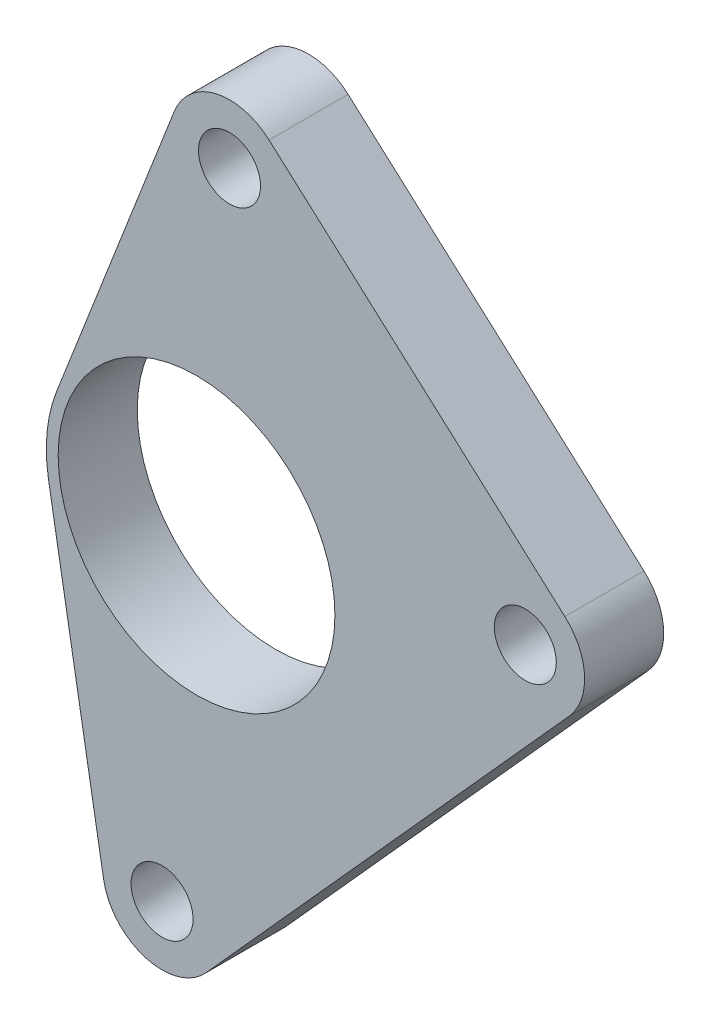
ISO-10303-21;
HEADER;
FILE_DESCRIPTION(('STEP AP214'),'2;1');
FILE_NAME('part.step','',(''),(''),'','','');
FILE_SCHEMA(('AUTOMOTIVE_DESIGN { 1 0 10303 214 1 1 1 1 }'));
ENDSEC;
DATA;
#1=APPLICATION_CONTEXT('core data for automotive mechanical design processes');
#2=APPLICATION_PROTOCOL_DEFINITION('international standard','automotive_design',2000,#1);
#3=PRODUCT_CONTEXT('',#1,'mechanical');
#4=PRODUCT('Part','Part','',(#3));
#5=PRODUCT_RELATED_PRODUCT_CATEGORY('part','',(#4));
#6=PRODUCT_DEFINITION_FORMATION('','',#4);
#7=PRODUCT_DEFINITION_CONTEXT('part definition',#1,'design');
#8=PRODUCT_DEFINITION('design','',#6,#7);
#9=PRODUCT_DEFINITION_SHAPE('','',#8);
#10=(LENGTH_UNIT() NAMED_UNIT(*) SI_UNIT(.MILLI.,.METRE.));
#11=(NAMED_UNIT(*) PLANE_ANGLE_UNIT() SI_UNIT($,.RADIAN.));
#12=(NAMED_UNIT(*) SI_UNIT($,.STERADIAN.) SOLID_ANGLE_UNIT());
#13=UNCERTAINTY_MEASURE_WITH_UNIT(LENGTH_MEASURE(1.E-05),#10,'distance_accuracy_value','');
#14=(GEOMETRIC_REPRESENTATION_CONTEXT(3) GLOBAL_UNCERTAINTY_ASSIGNED_CONTEXT((#13)) GLOBAL_UNIT_ASSIGNED_CONTEXT((#10,
#11,#12)) REPRESENTATION_CONTEXT('',''));
#15=CARTESIAN_POINT('',(0.,0.,0.));
#16=DIRECTION('',(0.,0.,1.));
#17=DIRECTION('',(1.,0.,0.));
#18=AXIS2_PLACEMENT_3D('',#15,#16,#17);
#19=CARTESIAN_POINT('',(-12.0465578661128,189.428701429059,6.35));
#20=DIRECTION('',(0.,0.,1.));
#21=DIRECTION('',(1.,0.,0.));
#22=AXIS2_PLACEMENT_3D('',#19,#20,#21);
#23=PLANE('',#22);
#24=CARTESIAN_POINT('',(17.1253729645223,221.865892196908,6.35));
#25=DIRECTION('',(0.,0.,1.));
#26=DIRECTION('',(1.,0.,0.));
#27=AXIS2_PLACEMENT_3D('',#24,#25,#26);
#28=CIRCLE('',#27,2.48920000000001);
#29=CARTESIAN_POINT('',(19.6145729645223,221.865892196908,6.35));
#30=VERTEX_POINT('',#29);
#31=EDGE_CURVE('E192',#30,#30,#28,.T.);
#32=ORIENTED_EDGE('',*,*,#31,.F.);
#33=EDGE_LOOP('',(#32));
#34=FACE_BOUND('',#33,.T.);
#35=CARTESIAN_POINT('',(-9.27636887368145,216.273648983416,6.35));
#36=DIRECTION('',(0.,0.,1.));
#37=DIRECTION('',(1.,0.,0.));
#38=AXIS2_PLACEMENT_3D('',#35,#36,#37);
#39=CIRCLE('',#38,11.1125);
#40=CARTESIAN_POINT('',(1.83613112631855,216.273648983416,6.35));
#41=VERTEX_POINT('',#40);
#42=EDGE_CURVE('E138',#41,#41,#39,.T.);
#43=ORIENTED_EDGE('',*,*,#42,.F.);
#44=EDGE_LOOP('',(#43));
#45=FACE_BOUND('',#44,.T.);
#46=CARTESIAN_POINT('',(-12.0465578661128,189.428701429059,6.35));
#47=DIRECTION('',(0.,0.,1.));
#48=DIRECTION('',(1.,0.,0.));
#49=AXIS2_PLACEMENT_3D('',#46,#47,#48);
#50=CIRCLE('',#49,4.76250000000002);
#51=CARTESIAN_POINT('',(-16.7394547128537,188.617452123451,6.35));
#52=VERTEX_POINT('',#51);
#53=CARTESIAN_POINT('',(-8.50545044137652,186.244056322225,6.35));
#54=VERTEX_POINT('',#53);
#55=EDGE_CURVE('E149',#52,#54,#50,.T.);
#56=ORIENTED_EDGE('',*,*,#55,.T.);
#57=DIRECTION('',(0.668691885949275,0.743539616742512,0.));
#58=VECTOR('',#57,1.);
#59=CARTESIAN_POINT('',(20.6664803892585,218.681247090074,6.35));
#60=LINE('',#59,#58);
#61=CARTESIAN_POINT('',(20.6664803892585,218.681247090074,6.35));
#62=VERTEX_POINT('',#61);
#63=EDGE_CURVE('E97',#54,#62,#60,.T.);
#64=ORIENTED_EDGE('',*,*,#63,.T.);
#65=CARTESIAN_POINT('',(17.1253729645223,221.865892196908,6.35));
#66=DIRECTION('',(0.,0.,1.));
#67=DIRECTION('',(1.,0.,0.));
#68=AXIS2_PLACEMENT_3D('',#65,#66,#67);
#69=CIRCLE('',#68,4.76250000000001);
#70=CARTESIAN_POINT('',(20.3018818801986,225.414299918496,6.35));
#71=VERTEX_POINT('',#70);
#72=EDGE_CURVE('E164',#62,#71,#69,.T.);
#73=ORIENTED_EDGE('',*,*,#72,.T.);
#74=DIRECTION('',(-0.745072487472647,0.666983499354611,0.));
#75=VECTOR('',#74,1.);
#76=CARTESIAN_POINT('',(-3.45293270630187,246.679438043739,6.35));
#77=LINE('',#76,#75);
#78=CARTESIAN_POINT('',(-3.45293270630187,246.679438043739,6.35));
#79=VERTEX_POINT('',#78);
#80=EDGE_CURVE('E177',#71,#79,#77,.T.);
#81=ORIENTED_EDGE('',*,*,#80,.T.);
#82=CARTESIAN_POINT('',(-6.6294416219782,243.13103032215,6.35));
#83=DIRECTION('',(0.,0.,1.));
#84=DIRECTION('',(1.,0.,0.));
#85=AXIS2_PLACEMENT_3D('',#82,#83,#84);
#86=CIRCLE('',#85,4.7625);
#87=CARTESIAN_POINT('',(-11.0657788250817,244.863173061754,6.35));
#88=VERTEX_POINT('',#87);
#89=EDGE_CURVE('E116',#79,#88,#86,.T.);
#90=ORIENTED_EDGE('',*,*,#89,.T.);
#91=DIRECTION('',(-0.363704512252614,-0.93151437335507,0.));
#92=VECTOR('',#91,1.);
#93=CARTESIAN_POINT('',(-20.5150897882104,220.661743923744,6.35));
#94=LINE('',#93,#92);
#95=CARTESIAN_POINT('',(-20.5150897882104,220.661743923744,6.35));
#96=VERTEX_POINT('',#95);
#97=EDGE_CURVE('E110',#88,#96,#94,.T.);
#98=ORIENTED_EDGE('',*,*,#97,.T.);
#99=CARTESIAN_POINT('',(-9.27636887368145,216.273648983416,6.35));
#100=DIRECTION('',(0.,0.,1.));
#101=DIRECTION('',(1.,0.,0.));
#102=AXIS2_PLACEMENT_3D('',#99,#100,#101);
#103=CIRCLE('',#102,12.065);
#104=CARTESIAN_POINT('',(-21.1650408854252,214.218484075877,6.35));
#105=VERTEX_POINT('',#104);
#106=EDGE_CURVE('E114',#96,#105,#103,.T.);
#107=ORIENTED_EDGE('',*,*,#106,.T.);
#108=DIRECTION('',(0.170341061544883,-0.98538516467002,0.));
#109=VECTOR('',#108,1.);
#110=CARTESIAN_POINT('',(-16.7394547128537,188.617452123451,6.35));
#111=LINE('',#110,#109);
#112=EDGE_CURVE('E54',#105,#52,#111,.T.);
#113=ORIENTED_EDGE('',*,*,#112,.T.);
#114=EDGE_LOOP('',(#56,#64,#73,#81,#90,#98,#107,#113));
#115=FACE_BOUND('',#114,.T.);
#116=CARTESIAN_POINT('',(-6.6294416219782,243.13103032215,6.35));
#117=DIRECTION('',(0.,0.,1.));
#118=DIRECTION('',(1.,0.,0.));
#119=AXIS2_PLACEMENT_3D('',#116,#117,#118);
#120=CIRCLE('',#119,2.48920000000002);
#121=CARTESIAN_POINT('',(-4.14024162197819,243.13103032215,6.35));
#122=VERTEX_POINT('',#121);
#123=EDGE_CURVE('E186',#122,#122,#120,.T.);
#124=ORIENTED_EDGE('',*,*,#123,.F.);
#125=EDGE_LOOP('',(#124));
#126=FACE_BOUND('',#125,.T.);
#127=CARTESIAN_POINT('',(-12.0465578661128,189.428701429059,6.35));
#128=DIRECTION('',(0.,0.,1.));
#129=DIRECTION('',(1.,0.,0.));
#130=AXIS2_PLACEMENT_3D('',#127,#128,#129);
#131=CIRCLE('',#130,2.48920000000001);
#132=CARTESIAN_POINT('',(-9.55735786611275,189.428701429059,6.35));
#133=VERTEX_POINT('',#132);
#134=EDGE_CURVE('E198',#133,#133,#131,.T.);
#135=ORIENTED_EDGE('',*,*,#134,.F.);
#136=EDGE_LOOP('',(#135));
#137=FACE_BOUND('',#136,.T.);
#138=ADVANCED_FACE('F37',(#34,#45,#115,#126,#137),#23,.T.);
#139=CARTESIAN_POINT('',(-12.0465578661128,189.428701429059,0.));
#140=DIRECTION('',(0.,0.,1.));
#141=DIRECTION('',(1.,0.,0.));
#142=AXIS2_PLACEMENT_3D('',#139,#140,#141);
#143=PLANE('',#142);
#144=CARTESIAN_POINT('',(-12.0465578661128,189.428701429059,0.));
#145=DIRECTION('',(0.,0.,1.));
#146=DIRECTION('',(1.,0.,0.));
#147=AXIS2_PLACEMENT_3D('',#144,#145,#146);
#148=CIRCLE('',#147,4.76250000000002);
#149=CARTESIAN_POINT('',(-16.7394547128537,188.617452123451,0.));
#150=VERTEX_POINT('',#149);
#151=CARTESIAN_POINT('',(-8.50545044137652,186.244056322225,0.));
#152=VERTEX_POINT('',#151);
#153=EDGE_CURVE('E134',#150,#152,#148,.T.);
#154=ORIENTED_EDGE('',*,*,#153,.F.);
#155=DIRECTION('',(0.170341061544883,-0.98538516467002,0.));
#156=VECTOR('',#155,1.);
#157=CARTESIAN_POINT('',(-16.7394547128537,188.617452123451,0.));
#158=LINE('',#157,#156);
#159=CARTESIAN_POINT('',(-21.1650408854252,214.218484075877,0.));
#160=VERTEX_POINT('',#159);
#161=EDGE_CURVE('E89',#160,#150,#158,.T.);
#162=ORIENTED_EDGE('',*,*,#161,.F.);
#163=CARTESIAN_POINT('',(-9.27636887368145,216.273648983416,0.));
#164=DIRECTION('',(0.,0.,1.));
#165=DIRECTION('',(1.,0.,0.));
#166=AXIS2_PLACEMENT_3D('',#163,#164,#165);
#167=CIRCLE('',#166,12.065);
#168=CARTESIAN_POINT('',(-20.5150897882104,220.661743923744,0.));
#169=VERTEX_POINT('',#168);
#170=EDGE_CURVE('E83',#169,#160,#167,.T.);
#171=ORIENTED_EDGE('',*,*,#170,.F.);
#172=DIRECTION('',(-0.363704512252614,-0.93151437335507,0.));
#173=VECTOR('',#172,1.);
#174=CARTESIAN_POINT('',(-20.5150897882104,220.661743923744,0.));
#175=LINE('',#174,#173);
#176=CARTESIAN_POINT('',(-11.0657788250817,244.863173061754,0.));
#177=VERTEX_POINT('',#176);
#178=EDGE_CURVE('E124',#177,#169,#175,.T.);
#179=ORIENTED_EDGE('',*,*,#178,.F.);
#180=CARTESIAN_POINT('',(-6.6294416219782,243.13103032215,0.));
#181=DIRECTION('',(0.,0.,1.));
#182=DIRECTION('',(1.,0.,0.));
#183=AXIS2_PLACEMENT_3D('',#180,#181,#182);
#184=CIRCLE('',#183,4.7625);
#185=CARTESIAN_POINT('',(-3.45293270630187,246.679438043739,0.));
#186=VERTEX_POINT('',#185);
#187=EDGE_CURVE('E144',#186,#177,#184,.T.);
#188=ORIENTED_EDGE('',*,*,#187,.F.);
#189=DIRECTION('',(-0.745072487472647,0.666983499354611,0.));
#190=VECTOR('',#189,1.);
#191=CARTESIAN_POINT('',(-3.45293270630187,246.679438043739,0.));
#192=LINE('',#191,#190);
#193=CARTESIAN_POINT('',(20.3018818801986,225.414299918496,0.));
#194=VERTEX_POINT('',#193);
#195=EDGE_CURVE('E142',#194,#186,#192,.T.);
#196=ORIENTED_EDGE('',*,*,#195,.F.);
#197=CARTESIAN_POINT('',(17.1253729645223,221.865892196908,0.));
#198=DIRECTION('',(0.,0.,1.));
#199=DIRECTION('',(1.,0.,0.));
#200=AXIS2_PLACEMENT_3D('',#197,#198,#199);
#201=CIRCLE('',#200,4.76250000000001);
#202=CARTESIAN_POINT('',(20.6664803892585,218.681247090074,0.));
#203=VERTEX_POINT('',#202);
#204=EDGE_CURVE('E140',#203,#194,#201,.T.);
#205=ORIENTED_EDGE('',*,*,#204,.F.);
#206=DIRECTION('',(0.668691885949275,0.743539616742512,0.));
#207=VECTOR('',#206,1.);
#208=CARTESIAN_POINT('',(20.6664803892585,218.681247090074,0.));
#209=LINE('',#208,#207);
#210=EDGE_CURVE('E137',#152,#203,#209,.T.);
#211=ORIENTED_EDGE('',*,*,#210,.F.);
#212=EDGE_LOOP('',(#154,#162,#171,#179,#188,#196,#205,#211));
#213=FACE_BOUND('',#212,.T.);
#214=CARTESIAN_POINT('',(-9.27636887368145,216.273648983416,0.));
#215=DIRECTION('',(0.,0.,1.));
#216=DIRECTION('',(1.,0.,0.));
#217=AXIS2_PLACEMENT_3D('',#214,#215,#216);
#218=CIRCLE('',#217,11.1125);
#219=CARTESIAN_POINT('',(1.83613112631855,216.273648983416,0.));
#220=VERTEX_POINT('',#219);
#221=EDGE_CURVE('E183',#220,#220,#218,.T.);
#222=ORIENTED_EDGE('',*,*,#221,.T.);
#223=EDGE_LOOP('',(#222));
#224=FACE_BOUND('',#223,.T.);
#225=CARTESIAN_POINT('',(-6.6294416219782,243.13103032215,0.));
#226=DIRECTION('',(0.,0.,1.));
#227=DIRECTION('',(1.,0.,0.));
#228=AXIS2_PLACEMENT_3D('',#225,#226,#227);
#229=CIRCLE('',#228,2.48920000000002);
#230=CARTESIAN_POINT('',(-4.14024162197819,243.13103032215,0.));
#231=VERTEX_POINT('',#230);
#232=EDGE_CURVE('E189',#231,#231,#229,.T.);
#233=ORIENTED_EDGE('',*,*,#232,.T.);
#234=EDGE_LOOP('',(#233));
#235=FACE_BOUND('',#234,.T.);
#236=CARTESIAN_POINT('',(17.1253729645223,221.865892196908,0.));
#237=DIRECTION('',(0.,0.,1.));
#238=DIRECTION('',(1.,0.,0.));
#239=AXIS2_PLACEMENT_3D('',#236,#237,#238);
#240=CIRCLE('',#239,2.48920000000001);
#241=CARTESIAN_POINT('',(19.6145729645223,221.865892196908,0.));
#242=VERTEX_POINT('',#241);
#243=EDGE_CURVE('E195',#242,#242,#240,.T.);
#244=ORIENTED_EDGE('',*,*,#243,.T.);
#245=EDGE_LOOP('',(#244));
#246=FACE_BOUND('',#245,.T.);
#247=CARTESIAN_POINT('',(-12.0465578661128,189.428701429059,0.));
#248=DIRECTION('',(0.,0.,1.));
#249=DIRECTION('',(1.,0.,0.));
#250=AXIS2_PLACEMENT_3D('',#247,#248,#249);
#251=CIRCLE('',#250,2.48920000000001);
#252=CARTESIAN_POINT('',(-9.55735786611275,189.428701429059,0.));
#253=VERTEX_POINT('',#252);
#254=EDGE_CURVE('E201',#253,#253,#251,.T.);
#255=ORIENTED_EDGE('',*,*,#254,.T.);
#256=EDGE_LOOP('',(#255));
#257=FACE_BOUND('',#256,.T.);
#258=ADVANCED_FACE('F168',(#213,#224,#235,#246,#257),#143,.F.);
#259=CARTESIAN_POINT('',(-12.0465578661128,189.428701429059,6.35));
#260=DIRECTION('',(0.,0.,-1.));
#261=DIRECTION('',(-1.,0.,0.));
#262=AXIS2_PLACEMENT_3D('',#259,#260,#261);
#263=CYLINDRICAL_SURFACE('',#262,4.76250000000002);
#264=ORIENTED_EDGE('',*,*,#153,.T.);
#265=DIRECTION('',(0.,0.,-1.));
#266=VECTOR('',#265,1.);
#267=CARTESIAN_POINT('',(-8.50545044137652,186.244056322225,6.35));
#268=LINE('',#267,#266);
#269=EDGE_CURVE('E11',#54,#152,#268,.T.);
#270=ORIENTED_EDGE('',*,*,#269,.F.);
#271=ORIENTED_EDGE('',*,*,#55,.F.);
#272=DIRECTION('',(0.,0.,-1.));
#273=VECTOR('',#272,1.);
#274=CARTESIAN_POINT('',(-16.7394547128537,188.617452123451,6.35));
#275=LINE('',#274,#273);
#276=EDGE_CURVE('E130',#52,#150,#275,.T.);
#277=ORIENTED_EDGE('',*,*,#276,.T.);
#278=EDGE_LOOP('',(#264,#270,#271,#277));
#279=FACE_BOUND('',#278,.T.);
#280=ADVANCED_FACE('F39',(#279),#263,.T.);
#281=CARTESIAN_POINT('',(20.6664803892585,218.681247090074,6.35));
#282=DIRECTION('',(-0.743539616742512,0.668691885949275,0.));
#283=DIRECTION('',(-0.668691885949275,-0.743539616742512,0.));
#284=AXIS2_PLACEMENT_3D('',#281,#282,#283);
#285=PLANE('',#284);
#286=ORIENTED_EDGE('',*,*,#210,.T.);
#287=DIRECTION('',(0.,0.,-1.));
#288=VECTOR('',#287,1.);
#289=CARTESIAN_POINT('',(20.6664803892585,218.681247090074,6.35));
#290=LINE('',#289,#288);
#291=EDGE_CURVE('E46',#62,#203,#290,.T.);
#292=ORIENTED_EDGE('',*,*,#291,.F.);
#293=ORIENTED_EDGE('',*,*,#63,.F.);
#294=ORIENTED_EDGE('',*,*,#269,.T.);
#295=EDGE_LOOP('',(#286,#292,#293,#294));
#296=FACE_BOUND('',#295,.T.);
#297=ADVANCED_FACE('F235',(#296),#285,.F.);
#298=CARTESIAN_POINT('',(17.1253729645223,221.865892196908,6.35));
#299=DIRECTION('',(0.,0.,-1.));
#300=DIRECTION('',(-1.,0.,0.));
#301=AXIS2_PLACEMENT_3D('',#298,#299,#300);
#302=CYLINDRICAL_SURFACE('',#301,4.76250000000001);
#303=ORIENTED_EDGE('',*,*,#204,.T.);
#304=DIRECTION('',(0.,0.,-1.));
#305=VECTOR('',#304,1.);
#306=CARTESIAN_POINT('',(20.3018818801986,225.414299918496,6.35));
#307=LINE('',#306,#305);
#308=EDGE_CURVE('E156',#71,#194,#307,.T.);
#309=ORIENTED_EDGE('',*,*,#308,.F.);
#310=ORIENTED_EDGE('',*,*,#72,.F.);
#311=ORIENTED_EDGE('',*,*,#291,.T.);
#312=EDGE_LOOP('',(#303,#309,#310,#311));
#313=FACE_BOUND('',#312,.T.);
#314=ADVANCED_FACE('F162',(#313),#302,.T.);
#315=CARTESIAN_POINT('',(-3.45293270630187,246.679438043739,6.35));
#316=DIRECTION('',(-0.666983499354611,-0.745072487472647,0.));
#317=DIRECTION('',(0.745072487472647,-0.666983499354611,0.));
#318=AXIS2_PLACEMENT_3D('',#315,#316,#317);
#319=PLANE('',#318);
#320=ORIENTED_EDGE('',*,*,#195,.T.);
#321=DIRECTION('',(0.,0.,-1.));
#322=VECTOR('',#321,1.);
#323=CARTESIAN_POINT('',(-3.45293270630187,246.679438043739,6.35));
#324=LINE('',#323,#322);
#325=EDGE_CURVE('E153',#79,#186,#324,.T.);
#326=ORIENTED_EDGE('',*,*,#325,.F.);
#327=ORIENTED_EDGE('',*,*,#80,.F.);
#328=ORIENTED_EDGE('',*,*,#308,.T.);
#329=EDGE_LOOP('',(#320,#326,#327,#328));
#330=FACE_BOUND('',#329,.T.);
#331=ADVANCED_FACE('F173',(#330),#319,.F.);
#332=CARTESIAN_POINT('',(-6.6294416219782,243.13103032215,6.35));
#333=DIRECTION('',(0.,0.,-1.));
#334=DIRECTION('',(-1.,0.,0.));
#335=AXIS2_PLACEMENT_3D('',#332,#333,#334);
#336=CYLINDRICAL_SURFACE('',#335,4.7625);
#337=ORIENTED_EDGE('',*,*,#187,.T.);
#338=DIRECTION('',(0.,0.,-1.));
#339=VECTOR('',#338,1.);
#340=CARTESIAN_POINT('',(-11.0657788250817,244.863173061754,6.35));
#341=LINE('',#340,#339);
#342=EDGE_CURVE('E125',#88,#177,#341,.T.);
#343=ORIENTED_EDGE('',*,*,#342,.F.);
#344=ORIENTED_EDGE('',*,*,#89,.F.);
#345=ORIENTED_EDGE('',*,*,#325,.T.);
#346=EDGE_LOOP('',(#337,#343,#344,#345));
#347=FACE_BOUND('',#346,.T.);
#348=ADVANCED_FACE('F176',(#347),#336,.T.);
#349=CARTESIAN_POINT('',(-20.5150897882104,220.661743923744,6.35));
#350=DIRECTION('',(0.93151437335507,-0.363704512252614,0.));
#351=DIRECTION('',(0.363704512252614,0.93151437335507,0.));
#352=AXIS2_PLACEMENT_3D('',#349,#350,#351);
#353=PLANE('',#352);
#354=ORIENTED_EDGE('',*,*,#178,.T.);
#355=DIRECTION('',(0.,0.,-1.));
#356=VECTOR('',#355,1.);
#357=CARTESIAN_POINT('',(-20.5150897882104,220.661743923744,6.35));
#358=LINE('',#357,#356);
#359=EDGE_CURVE('E121',#96,#169,#358,.T.);
#360=ORIENTED_EDGE('',*,*,#359,.F.);
#361=ORIENTED_EDGE('',*,*,#97,.F.);
#362=ORIENTED_EDGE('',*,*,#342,.T.);
#363=EDGE_LOOP('',(#354,#360,#361,#362));
#364=FACE_BOUND('',#363,.T.);
#365=ADVANCED_FACE('F122',(#364),#353,.F.);
#366=CARTESIAN_POINT('',(-9.27636887368145,216.273648983416,6.35));
#367=DIRECTION('',(0.,0.,-1.));
#368=DIRECTION('',(-1.,0.,0.));
#369=AXIS2_PLACEMENT_3D('',#366,#367,#368);
#370=CYLINDRICAL_SURFACE('',#369,12.065);
#371=ORIENTED_EDGE('',*,*,#170,.T.);
#372=DIRECTION('',(0.,0.,-1.));
#373=VECTOR('',#372,1.);
#374=CARTESIAN_POINT('',(-21.1650408854252,214.218484075877,6.35));
#375=LINE('',#374,#373);
#376=EDGE_CURVE('E126',#105,#160,#375,.T.);
#377=ORIENTED_EDGE('',*,*,#376,.F.);
#378=ORIENTED_EDGE('',*,*,#106,.F.);
#379=ORIENTED_EDGE('',*,*,#359,.T.);
#380=EDGE_LOOP('',(#371,#377,#378,#379));
#381=FACE_BOUND('',#380,.T.);
#382=ADVANCED_FACE('F128',(#381),#370,.T.);
#383=CARTESIAN_POINT('',(-16.7394547128537,188.617452123451,6.35));
#384=DIRECTION('',(0.98538516467002,0.170341061544883,0.));
#385=DIRECTION('',(-0.170341061544883,0.98538516467002,0.));
#386=AXIS2_PLACEMENT_3D('',#383,#384,#385);
#387=PLANE('',#386);
#388=ORIENTED_EDGE('',*,*,#161,.T.);
#389=ORIENTED_EDGE('',*,*,#276,.F.);
#390=ORIENTED_EDGE('',*,*,#112,.F.);
#391=ORIENTED_EDGE('',*,*,#376,.T.);
#392=EDGE_LOOP('',(#388,#389,#390,#391));
#393=FACE_BOUND('',#392,.T.);
#394=ADVANCED_FACE('F223',(#393),#387,.F.);
#395=CARTESIAN_POINT('',(-9.27636887368145,216.273648983416,6.35));
#396=DIRECTION('',(0.,0.,-1.));
#397=DIRECTION('',(-1.,0.,0.));
#398=AXIS2_PLACEMENT_3D('',#395,#396,#397);
#399=CYLINDRICAL_SURFACE('',#398,11.1125);
#400=ORIENTED_EDGE('',*,*,#42,.T.);
#401=EDGE_LOOP('',(#400));
#402=FACE_BOUND('',#401,.T.);
#403=ORIENTED_EDGE('',*,*,#221,.F.);
#404=EDGE_LOOP('',(#403));
#405=FACE_BOUND('',#404,.T.);
#406=ADVANCED_FACE('F220',(#402,#405),#399,.F.);
#407=CARTESIAN_POINT('',(-6.6294416219782,243.13103032215,6.35));
#408=DIRECTION('',(0.,0.,-1.));
#409=DIRECTION('',(-1.,0.,0.));
#410=AXIS2_PLACEMENT_3D('',#407,#408,#409);
#411=CYLINDRICAL_SURFACE('',#410,2.48920000000002);
#412=ORIENTED_EDGE('',*,*,#123,.T.);
#413=EDGE_LOOP('',(#412));
#414=FACE_BOUND('',#413,.T.);
#415=ORIENTED_EDGE('',*,*,#232,.F.);
#416=EDGE_LOOP('',(#415));
#417=FACE_BOUND('',#416,.T.);
#418=ADVANCED_FACE('F311',(#414,#417),#411,.F.);
#419=CARTESIAN_POINT('',(17.1253729645223,221.865892196908,6.35));
#420=DIRECTION('',(0.,0.,-1.));
#421=DIRECTION('',(-1.,0.,0.));
#422=AXIS2_PLACEMENT_3D('',#419,#420,#421);
#423=CYLINDRICAL_SURFACE('',#422,2.48920000000001);
#424=ORIENTED_EDGE('',*,*,#31,.T.);
#425=EDGE_LOOP('',(#424));
#426=FACE_BOUND('',#425,.T.);
#427=ORIENTED_EDGE('',*,*,#243,.F.);
#428=EDGE_LOOP('',(#427));
#429=FACE_BOUND('',#428,.T.);
#430=ADVANCED_FACE('F320',(#426,#429),#423,.F.);
#431=CARTESIAN_POINT('',(-12.0465578661128,189.428701429059,6.35));
#432=DIRECTION('',(0.,0.,-1.));
#433=DIRECTION('',(-1.,0.,0.));
#434=AXIS2_PLACEMENT_3D('',#431,#432,#433);
#435=CYLINDRICAL_SURFACE('',#434,2.48920000000001);
#436=ORIENTED_EDGE('',*,*,#134,.T.);
#437=EDGE_LOOP('',(#436));
#438=FACE_BOUND('',#437,.T.);
#439=ORIENTED_EDGE('',*,*,#254,.F.);
#440=EDGE_LOOP('',(#439));
#441=FACE_BOUND('',#440,.T.);
#442=ADVANCED_FACE('F207',(#438,#441),#435,.F.);
#443=CLOSED_SHELL('',(#138,#258,#280,#297,#314,#331,#348,#365,#382,#394,#406,#418,#430,#442));
#444=MANIFOLD_SOLID_BREP('B2',#443);
#445=ADVANCED_BREP_SHAPE_REPRESENTATION('',(#18,#444),#14);
#446=SHAPE_DEFINITION_REPRESENTATION(#9,#445);
ENDSEC;
END-ISO-10303-21;
